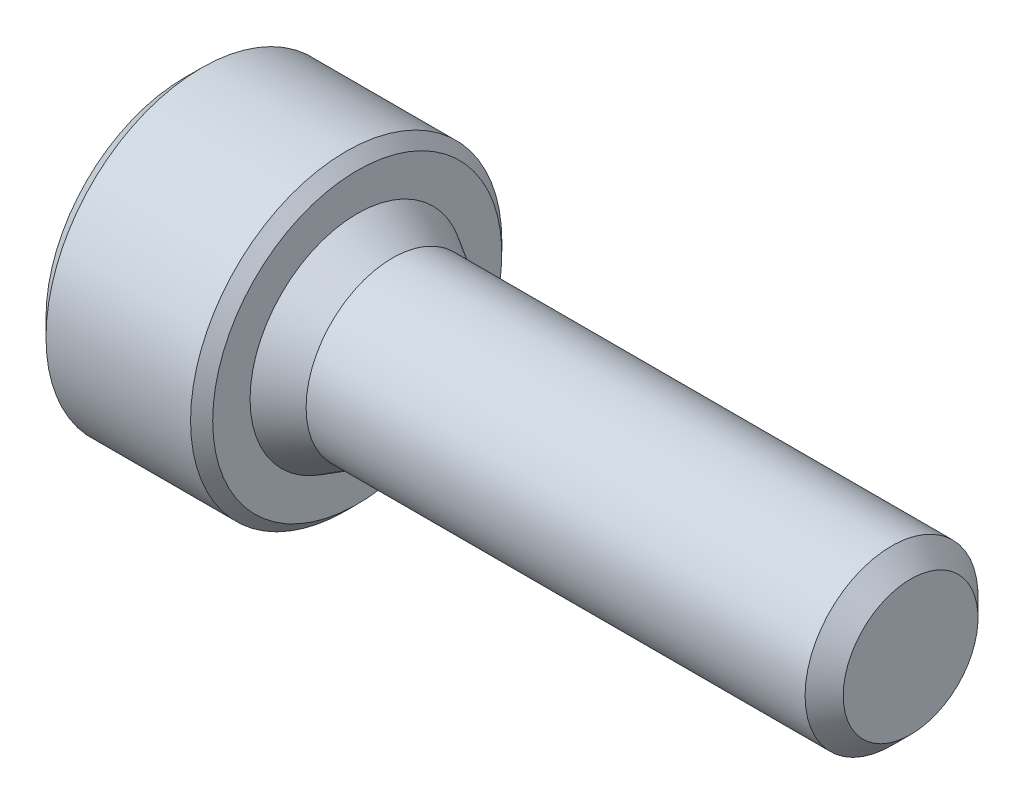
ISO-10303-21;
HEADER;
FILE_DESCRIPTION(('STEP AP214'),'2;1');
FILE_NAME('part.step','',(''),(''),'','','');
FILE_SCHEMA(('AUTOMOTIVE_DESIGN { 1 0 10303 214 1 1 1 1 }'));
ENDSEC;
DATA;
#1=APPLICATION_CONTEXT('core data for automotive mechanical design processes');
#2=APPLICATION_PROTOCOL_DEFINITION('international standard','automotive_design',2000,#1);
#3=PRODUCT_CONTEXT('',#1,'mechanical');
#4=PRODUCT('Part','Part','',(#3));
#5=PRODUCT_RELATED_PRODUCT_CATEGORY('part','',(#4));
#6=PRODUCT_DEFINITION_FORMATION('','',#4);
#7=PRODUCT_DEFINITION_CONTEXT('part definition',#1,'design');
#8=PRODUCT_DEFINITION('design','',#6,#7);
#9=PRODUCT_DEFINITION_SHAPE('','',#8);
#10=(LENGTH_UNIT() NAMED_UNIT(*) SI_UNIT(.MILLI.,.METRE.));
#11=(NAMED_UNIT(*) PLANE_ANGLE_UNIT() SI_UNIT($,.RADIAN.));
#12=(NAMED_UNIT(*) SI_UNIT($,.STERADIAN.) SOLID_ANGLE_UNIT());
#13=UNCERTAINTY_MEASURE_WITH_UNIT(LENGTH_MEASURE(1.E-05),#10,'distance_accuracy_value','');
#14=(GEOMETRIC_REPRESENTATION_CONTEXT(3) GLOBAL_UNCERTAINTY_ASSIGNED_CONTEXT((#13)) GLOBAL_UNIT_ASSIGNED_CONTEXT((#10,
#11,#12)) REPRESENTATION_CONTEXT('',''));
#15=CARTESIAN_POINT('',(0.,0.,0.));
#16=DIRECTION('',(0.,0.,1.));
#17=DIRECTION('',(1.,0.,0.));
#18=AXIS2_PLACEMENT_3D('',#15,#16,#17);
#19=CARTESIAN_POINT('',(-2.36,0.,0.));
#20=DIRECTION('',(-1.,0.,0.));
#21=DIRECTION('',(0.,0.,1.));
#22=AXIS2_PLACEMENT_3D('',#19,#20,#21);
#23=CONICAL_SURFACE('',#22,1.,0.785398163397448);
#24=CARTESIAN_POINT('',(-3.36750105605465,-1.7407068937821,1.));
#25=CARTESIAN_POINT('',(-3.32286035027482,-1.68920392528092,1.));
#26=CARTESIAN_POINT('',(-3.27847887616892,-1.63747156166965,1.));
#27=CARTESIAN_POINT('',(-3.19041923166882,-1.5333701326991,1.));
#28=CARTESIAN_POINT('',(-3.14674140658326,-1.4810007756127,1.));
#29=CARTESIAN_POINT('',(-3.05931926103156,-1.37427842795263,1.));
#30=CARTESIAN_POINT('',(-3.01559668363728,-1.31990755405581,1.));
#31=CARTESIAN_POINT('',(-2.92948251669072,-1.21013905597685,1.));
#32=CARTESIAN_POINT('',(-2.88709059607565,-1.15474169272461,1.));
#33=CARTESIAN_POINT('',(-2.8040857047358,-1.04250399658773,1.));
#34=CARTESIAN_POINT('',(-2.76347521302879,-0.985661816535441,1.));
#35=CARTESIAN_POINT('',(-2.68487260640411,-0.87010806023053,1.));
#36=CARTESIAN_POINT('',(-2.64688264047748,-0.811395006093561,1.));
#37=CARTESIAN_POINT('',(-2.57515477532347,-0.69199827583144,1.));
#38=CARTESIAN_POINT('',(-2.54138616662624,-0.631333428155187,1.));
#39=CARTESIAN_POINT('',(-2.47991094550356,-0.507072634282912,1.));
#40=CARTESIAN_POINT('',(-2.45219316281335,-0.443482356069482,1.));
#41=CARTESIAN_POINT('',(-2.405499272471,-0.311321221991875,1.));
#42=CARTESIAN_POINT('',(-2.38673222526023,-0.24267084963982,1.));
#43=CARTESIAN_POINT('',(-2.36891272303976,-0.138150227370316,1.));
#44=CARTESIAN_POINT('',(-2.36469235030083,-0.103148228277481,1.));
#45=CARTESIAN_POINT('',(-2.35992878436096,-0.0328881435845683,1.));
#46=CARTESIAN_POINT('',(-2.35938521022145,0.0023699151072618,1.));
#47=CARTESIAN_POINT('',(-2.36202627188818,0.0727827684601028,1.));
#48=CARTESIAN_POINT('',(-2.36521522408333,0.107937396341259,1.));
#49=CARTESIAN_POINT('',(-2.3750867935487,0.177755171881169,1.));
#50=CARTESIAN_POINT('',(-2.38177068246881,0.212418135927244,1.));
#51=CARTESIAN_POINT('',(-2.39825291567442,0.281238942104452,1.));
#52=CARTESIAN_POINT('',(-2.40807270953323,0.315391557797059,1.));
#53=CARTESIAN_POINT('',(-2.43030221574655,0.382829270052337,1.));
#54=CARTESIAN_POINT('',(-2.44271195410737,0.416114357900164,1.));
#55=CARTESIAN_POINT('',(-2.48917118352782,0.529593235871621,1.));
#56=CARTESIAN_POINT('',(-2.52845132750847,0.60763092048968,1.));
#57=CARTESIAN_POINT('',(-2.61424227576997,0.75964530278962,1.));
#58=CARTESIAN_POINT('',(-2.6607713632772,0.833611073776003,1.));
#59=CARTESIAN_POINT('',(-2.75840757314621,0.979002191609964,1.));
#60=CARTESIAN_POINT('',(-2.80953783045008,1.05041185113874,1.));
#61=CARTESIAN_POINT('',(-2.91449776435082,1.19106754475187,1.));
#62=CARTESIAN_POINT('',(-2.96832442390138,1.26031586229541,1.));
#63=CARTESIAN_POINT('',(-3.07923007988276,1.39912403822832,1.));
#64=CARTESIAN_POINT('',(-3.13635725354785,1.46864516086898,1.));
#65=CARTESIAN_POINT('',(-3.251364268709,1.60579506034282,1.));
#66=CARTESIAN_POINT('',(-3.30922938917019,1.67343615148247,1.));
#67=CARTESIAN_POINT('',(-3.36750105605455,1.74070689378218,1.));
#68=B_SPLINE_CURVE_WITH_KNOTS('',3,(#24,#25,#26,#27,#28,#29,#30,#31,#32,#33,#34,#35,#36,#37,#38,
#39,#40,#41,#42,#43,#44,#45,#46,#47,#48,#49,#50,#51,#52,#53,#54,#55,#56,#57,#58,#59,#60,#61,#62,
#63,#64,#65,#66,#67),.UNSPECIFIED.,.F.,.F.,(4,2,2,2,2,2,2,2,2,2,2,2,2,2,2,2,2,2,2,2,2,4),(0.,
0.204474811377923,0.409047084486791,0.618342060877502,0.8275845458936,1.03710952772991,
1.24680433886958,1.45487185547542,1.66255195369686,1.87487033826994,1.98046582804522,
2.0860503773216,2.19175714800707,2.29750240741124,2.4039870399009,2.51047274168118,
2.77177332949078,3.03374396802011,3.29711449528732,3.56019664346829,3.8301208425605,
4.09713952953361),.UNSPECIFIED.);
#69=CARTESIAN_POINT('',(-2.5,-0.54735728733616,1.));
#70=VERTEX_POINT('',#69);
#71=CARTESIAN_POINT('',(-2.49999999999974,0.547357287338057,1.));
#72=VERTEX_POINT('',#71);
#73=EDGE_CURVE('E229',#70,#72,#68,.T.);
#74=ORIENTED_EDGE('',*,*,#73,.F.);
#75=CARTESIAN_POINT('',(-2.5,0.,0.));
#76=DIRECTION('',(-1.,0.,0.));
#77=DIRECTION('',(0.,0.,1.));
#78=AXIS2_PLACEMENT_3D('',#75,#76,#77);
#79=CIRCLE('',#78,1.14);
#80=EDGE_CURVE('E246',#70,#72,#79,.T.);
#81=ORIENTED_EDGE('',*,*,#80,.T.);
#82=EDGE_LOOP('',(#74,#81));
#83=FACE_BOUND('',#82,.T.);
#84=ADVANCED_FACE('F43',(#83),#23,.F.);
#85=CARTESIAN_POINT('',(-2.50020000000003,0.592138547582809,0.974385950466541));
#86=CARTESIAN_POINT('',(-2.48196320584127,0.611131278014126,0.94148957638504));
#87=CARTESIAN_POINT('',(-2.46486510812971,0.630432709829491,0.908058515822001));
#88=CARTESIAN_POINT('',(-2.43368233068803,0.669741655848315,0.839973424125417));
#89=CARTESIAN_POINT('',(-2.41961317850148,0.689752223242682,0.805314104710092));
#90=CARTESIAN_POINT('',(-2.39559404018121,0.73009123293689,0.73544489039271));
#91=CARTESIAN_POINT('',(-2.38558877451638,0.750411215758033,0.700249647737563));
#92=CARTESIAN_POINT('',(-2.37025957634421,0.791456431947178,0.629157247890316));
#93=CARTESIAN_POINT('',(-2.36492558212902,0.81218069551893,0.593261770434592));
#94=CARTESIAN_POINT('',(-2.3601188050706,0.848616165357843,0.530153685475951));
#95=CARTESIAN_POINT('',(-2.35951760086495,0.864291206467804,0.503003717862768));
#96=CARTESIAN_POINT('',(-2.36125744550118,0.895601959388011,0.448771902981733));
#97=CARTESIAN_POINT('',(-2.36359925639881,0.911237659960926,0.421690075177512));
#98=CARTESIAN_POINT('',(-2.37487645271091,0.957903588586549,0.340862315815549));
#99=CARTESIAN_POINT('',(-2.3880638020648,0.988690977957282,0.287536993193034));
#100=CARTESIAN_POINT('',(-2.41781345749885,1.0396576005191,0.199260213425773));
#101=CARTESIAN_POINT('',(-2.4321047440116,1.06019762175112,0.16368385306337));
#102=CARTESIAN_POINT('',(-2.46394027183121,1.10056406598303,0.0937671207328113));
#103=CARTESIAN_POINT('',(-2.48147342530142,1.12039265419409,0.0594229985089012));
#104=CARTESIAN_POINT('',(-2.5002,1.13991225998605,0.0256140495335122));
#105=B_SPLINE_CURVE_WITH_KNOTS('',3,(#85,#86,#87,#88,#89,#90,#91,#92,#93,#94,#95,#96,#97,#98,
#99,#100,#101,#102,#103,#104),.UNSPECIFIED.,.F.,.F.,(4,2,2,2,2,2,2,2,2,4),(0.,0.126486904548906,
0.25360755438275,0.378935926747812,0.503993678761193,0.597924039528067,0.691878727360582,
0.879797958474502,1.01015691721643,1.14007800353995),.UNSPECIFIED.);
#106=CARTESIAN_POINT('',(-2.5,0.592346760116365,0.974025315779649));
#107=VERTEX_POINT('',#106);
#108=CARTESIAN_POINT('',(-2.5,1.13970404745252,0.0259746842203549));
#109=VERTEX_POINT('',#108);
#110=EDGE_CURVE('E362',#107,#109,#105,.T.);
#111=ORIENTED_EDGE('',*,*,#110,.F.);
#112=EDGE_CURVE('E251',#107,#109,#79,.T.);
#113=ORIENTED_EDGE('',*,*,#112,.T.);
#114=EDGE_LOOP('',(#111,#113));
#115=FACE_BOUND('',#114,.T.);
#116=ADVANCED_FACE('F297',(#115),#23,.F.);
#117=CARTESIAN_POINT('',(-2.5002,1.13991225998605,-0.0256140495335521));
#118=CARTESIAN_POINT('',(-2.48196320584124,1.12091952955473,-0.0585104236150492));
#119=CARTESIAN_POINT('',(-2.46486510812969,1.10161809773937,-0.0919414841780837));
#120=CARTESIAN_POINT('',(-2.43368233068802,1.06230915172055,-0.160026575874659));
#121=CARTESIAN_POINT('',(-2.41961317850147,1.04229858432618,-0.19468589528998));
#122=CARTESIAN_POINT('',(-2.39559404018121,1.00195957463198,-0.264555109607352));
#123=CARTESIAN_POINT('',(-2.38558877451638,0.981639591810842,-0.299750352262494));
#124=CARTESIAN_POINT('',(-2.37025957634422,0.940594375621704,-0.37084275210973));
#125=CARTESIAN_POINT('',(-2.36492558212903,0.919870112049954,-0.406738229565449));
#126=CARTESIAN_POINT('',(-2.36011880507061,0.883434642211044,-0.469846314524085));
#127=CARTESIAN_POINT('',(-2.35951760086497,0.867759601101083,-0.496996282137268));
#128=CARTESIAN_POINT('',(-2.3612574455012,0.836448848180875,-0.551228097018303));
#129=CARTESIAN_POINT('',(-2.36359925639883,0.820813147607961,-0.578309924822525));
#130=CARTESIAN_POINT('',(-2.37487645271093,0.774147218982337,-0.659137684184488));
#131=CARTESIAN_POINT('',(-2.38806380206482,0.743359829611604,-0.712463006807004));
#132=CARTESIAN_POINT('',(-2.41781345749887,0.692393207049783,-0.800739786574265));
#133=CARTESIAN_POINT('',(-2.43210474401162,0.671853185817763,-0.836316146936667));
#134=CARTESIAN_POINT('',(-2.46394027183124,0.631486741585857,-0.906232879267224));
#135=CARTESIAN_POINT('',(-2.48147342530145,0.611658153374801,-0.940577001491133));
#136=CARTESIAN_POINT('',(-2.50020000000003,0.592138547582843,-0.974385950466521));
#137=B_SPLINE_CURVE_WITH_KNOTS('',3,(#117,#118,#119,#120,#121,#122,#123,#124,#125,#126,#127,
#128,#129,#130,#131,#132,#133,#134,#135,#136),.UNSPECIFIED.,.F.,.F.,(4,2,2,2,2,2,2,2,2,4),(0.,
0.126486904548886,0.25360755438271,0.378935926747753,0.503993678761114,0.59792403952799,
0.691878727360506,0.879797958474429,1.01015691721635,1.14007800353988),.UNSPECIFIED.);
#138=CARTESIAN_POINT('',(-2.5,1.13970404745252,-0.0259746842203947));
#139=VERTEX_POINT('',#138);
#140=CARTESIAN_POINT('',(-2.5,0.5923467601164,-0.974025315779628));
#141=VERTEX_POINT('',#140);
#142=EDGE_CURVE('E355',#139,#141,#137,.T.);
#143=ORIENTED_EDGE('',*,*,#142,.F.);
#144=EDGE_CURVE('E340',#139,#141,#79,.T.);
#145=ORIENTED_EDGE('',*,*,#144,.T.);
#146=EDGE_LOOP('',(#143,#145));
#147=FACE_BOUND('',#146,.T.);
#148=ADVANCED_FACE('F302',(#147),#23,.F.);
#149=CARTESIAN_POINT('',(-3.36750105605467,1.7407068937821,-1.00000000000004));
#150=CARTESIAN_POINT('',(-3.32286035027484,1.68920392528092,-1.00000000000004));
#151=CARTESIAN_POINT('',(-3.27847887616894,1.63747156166965,-1.00000000000004));
#152=CARTESIAN_POINT('',(-3.19041923166884,1.5333701326991,-1.00000000000004));
#153=CARTESIAN_POINT('',(-3.14674140658328,1.48100077561269,-1.00000000000004));
#154=CARTESIAN_POINT('',(-3.05931926103158,1.37427842795263,-1.00000000000004));
#155=CARTESIAN_POINT('',(-3.0155966836373,1.31990755405581,-1.00000000000004));
#156=CARTESIAN_POINT('',(-2.92948251669074,1.21013905597684,-1.00000000000004));
#157=CARTESIAN_POINT('',(-2.88709059607567,1.15474169272461,-1.00000000000004));
#158=CARTESIAN_POINT('',(-2.80408570473582,1.04250399658772,-1.00000000000004));
#159=CARTESIAN_POINT('',(-2.76347521302881,0.985661816535433,-1.00000000000004));
#160=CARTESIAN_POINT('',(-2.68487260640413,0.870108060230519,-1.00000000000004));
#161=CARTESIAN_POINT('',(-2.64688264047751,0.811395006093549,-1.00000000000004));
#162=CARTESIAN_POINT('',(-2.5751547753235,0.691998275831427,-1.00000000000004));
#163=CARTESIAN_POINT('',(-2.54138616662627,0.631333428155172,-1.00000000000004));
#164=CARTESIAN_POINT('',(-2.47991094550358,0.507072634282896,-1.00000000000004));
#165=CARTESIAN_POINT('',(-2.45219316281338,0.443482356069465,-1.00000000000004));
#166=CARTESIAN_POINT('',(-2.40549927247103,0.311321221991855,-1.00000000000004));
#167=CARTESIAN_POINT('',(-2.38673222526026,0.2426708496398,-1.00000000000004));
#168=CARTESIAN_POINT('',(-2.36891272303979,0.138150227370294,-1.00000000000004));
#169=CARTESIAN_POINT('',(-2.36469235030087,0.103148228277459,-1.00000000000004));
#170=CARTESIAN_POINT('',(-2.359928784361,0.0328881435845455,-1.00000000000004));
#171=CARTESIAN_POINT('',(-2.35938521022149,-0.00236991510728479,-1.00000000000004));
#172=CARTESIAN_POINT('',(-2.36202627188822,-0.072782768460126,-1.00000000000004));
#173=CARTESIAN_POINT('',(-2.36521522408337,-0.107937396341282,-1.00000000000004));
#174=CARTESIAN_POINT('',(-2.37508679354875,-0.177755171881192,-1.00000000000004));
#175=CARTESIAN_POINT('',(-2.38177068246885,-0.212418135927268,-1.00000000000004));
#176=CARTESIAN_POINT('',(-2.39825291567447,-0.281238942104476,-1.00000000000004));
#177=CARTESIAN_POINT('',(-2.40807270953327,-0.315391557797083,-1.00000000000004));
#178=CARTESIAN_POINT('',(-2.4303022157466,-0.38282927005236,-1.00000000000004));
#179=CARTESIAN_POINT('',(-2.44271195410741,-0.416114357900188,-1.00000000000004));
#180=CARTESIAN_POINT('',(-2.48917118352787,-0.52959323587165,-1.00000000000004));
#181=CARTESIAN_POINT('',(-2.52845132750852,-0.607630920489714,-1.00000000000004));
#182=CARTESIAN_POINT('',(-2.61424227577002,-0.759645302789663,-1.00000000000004));
#183=CARTESIAN_POINT('',(-2.66077136327726,-0.83361107377605,-1.00000000000004));
#184=CARTESIAN_POINT('',(-2.75840757314627,-0.97900219161002,-1.00000000000004));
#185=CARTESIAN_POINT('',(-2.80953783045015,-1.0504118511388,-1.00000000000004));
#186=CARTESIAN_POINT('',(-2.9144977643509,-1.19106754475194,-1.00000000000004));
#187=CARTESIAN_POINT('',(-2.96832442390146,-1.26031586229548,-1.00000000000004));
#188=CARTESIAN_POINT('',(-3.07923007988284,-1.39912403822839,-1.00000000000004));
#189=CARTESIAN_POINT('',(-3.13635725354792,-1.46864516086903,-1.00000000000004));
#190=CARTESIAN_POINT('',(-3.25136426870904,-1.60579506034284,-1.00000000000004));
#191=CARTESIAN_POINT('',(-3.30922938917022,-1.67343615148248,-1.00000000000004));
#192=CARTESIAN_POINT('',(-3.36750105605457,-1.74070689378218,-1.00000000000004));
#193=B_SPLINE_CURVE_WITH_KNOTS('',3,(#149,#150,#151,#152,#153,#154,#155,#156,#157,#158,#159,
#160,#161,#162,#163,#164,#165,#166,#167,#168,#169,#170,#171,#172,#173,#174,#175,#176,#177,#178,
#179,#180,#181,#182,#183,#184,#185,#186,#187,#188,#189,#190,#191,#192),.UNSPECIFIED.,.F.,.F.,(4,
2,2,2,2,2,2,2,2,2,2,2,2,2,2,2,2,2,2,2,2,4),(0.,0.204474811377925,0.409047084486793,
0.618342060877506,0.827584545893605,1.03710952772991,1.24680433886959,1.45487185547543,
1.66255195369687,1.87487033826995,1.98046582804523,2.08605037732162,2.19175714800708,
2.29750240741125,2.40398703990092,2.51047274168119,2.77177332949081,3.03374396802016,
3.29711449528739,3.56019664346837,3.83012084256053,4.09713952953359),.UNSPECIFIED.);
#194=CARTESIAN_POINT('',(-2.5,0.54735728733609,-1.00000000000004));
#195=VERTEX_POINT('',#194);
#196=CARTESIAN_POINT('',(-2.49999999999974,-0.547357287337986,-1.00000000000004));
#197=VERTEX_POINT('',#196);
#198=EDGE_CURVE('E347',#195,#197,#193,.T.);
#199=ORIENTED_EDGE('',*,*,#198,.F.);
#200=EDGE_CURVE('E338',#195,#197,#79,.T.);
#201=ORIENTED_EDGE('',*,*,#200,.T.);
#202=EDGE_LOOP('',(#199,#201));
#203=FACE_BOUND('',#202,.T.);
#204=ADVANCED_FACE('F316',(#203),#23,.F.);
#205=CARTESIAN_POINT('',(-2.50020000000003,-0.592138547582843,-0.974385950466521));
#206=CARTESIAN_POINT('',(-2.48196320584127,-0.611131278014159,-0.941489576385021));
#207=CARTESIAN_POINT('',(-2.46486510812971,-0.630432709829523,-0.908058515821984));
#208=CARTESIAN_POINT('',(-2.43368233068804,-0.669741655848345,-0.839973424125403));
#209=CARTESIAN_POINT('',(-2.41961317850149,-0.689752223242711,-0.805314104710079));
#210=CARTESIAN_POINT('',(-2.39559404018122,-0.730091232936917,-0.735444890392701));
#211=CARTESIAN_POINT('',(-2.38558877451639,-0.750411215758059,-0.700249647737556));
#212=CARTESIAN_POINT('',(-2.37025957634423,-0.791456431947202,-0.629157247890313));
#213=CARTESIAN_POINT('',(-2.36492558212903,-0.812180695518953,-0.593261770434591));
#214=CARTESIAN_POINT('',(-2.36011880507062,-0.848616165357865,-0.530153685475951));
#215=CARTESIAN_POINT('',(-2.35951760086497,-0.864291206467826,-0.503003717862768));
#216=CARTESIAN_POINT('',(-2.3612574455012,-0.895601959388034,-0.448771902981733));
#217=CARTESIAN_POINT('',(-2.36359925639883,-0.911237659960949,-0.421690075177511));
#218=CARTESIAN_POINT('',(-2.37487645271093,-0.957903588586573,-0.340862315815547));
#219=CARTESIAN_POINT('',(-2.38806380206482,-0.988690977957306,-0.287536993193031));
#220=CARTESIAN_POINT('',(-2.41781345749887,-1.03965760051912,-0.199260213425777));
#221=CARTESIAN_POINT('',(-2.43210474401161,-1.06019762175114,-0.163683853063382));
#222=CARTESIAN_POINT('',(-2.46394027183122,-1.10056406598304,-0.0937671207328372));
#223=CARTESIAN_POINT('',(-2.48147342530143,-1.12039265419409,-0.0594229985089343));
#224=CARTESIAN_POINT('',(-2.5002,-1.13991225998605,-0.0256140495335522));
#225=B_SPLINE_CURVE_WITH_KNOTS('',3,(#205,#206,#207,#208,#209,#210,#211,#212,#213,#214,#215,
#216,#217,#218,#219,#220,#221,#222,#223,#224),.UNSPECIFIED.,.F.,.F.,(4,2,2,2,2,2,2,2,2,4),(0.,
0.126486904548899,0.253607554382735,0.37893592674779,0.503993678761164,0.597924039528039,
0.691878727360556,0.879797958474479,1.01015691721638,1.14007800353988),.UNSPECIFIED.);
#226=CARTESIAN_POINT('',(-2.5,-0.592346760116399,-0.974025315779628));
#227=VERTEX_POINT('',#226);
#228=CARTESIAN_POINT('',(-2.5,-1.13970404745252,-0.0259746842203946));
#229=VERTEX_POINT('',#228);
#230=EDGE_CURVE('E327',#227,#229,#225,.T.);
#231=ORIENTED_EDGE('',*,*,#230,.F.);
#232=EDGE_CURVE('E329',#227,#229,#79,.T.);
#233=ORIENTED_EDGE('',*,*,#232,.T.);
#234=EDGE_LOOP('',(#231,#233));
#235=FACE_BOUND('',#234,.T.);
#236=ADVANCED_FACE('F307',(#235),#23,.F.);
#237=CARTESIAN_POINT('',(0.,2.25,0.));
#238=DIRECTION('',(-1.,0.,0.));
#239=DIRECTION('',(0.,0.,1.));
#240=AXIS2_PLACEMENT_3D('',#237,#238,#239);
#241=PLANE('',#240);
#242=CARTESIAN_POINT('',(0.,0.,0.));
#243=DIRECTION('',(-1.,0.,0.));
#244=DIRECTION('',(0.,0.,1.));
#245=AXIS2_PLACEMENT_3D('',#242,#243,#244);
#246=CIRCLE('',#245,1.55);
#247=CARTESIAN_POINT('',(0.,0.,1.55));
#248=VERTEX_POINT('',#247);
#249=EDGE_CURVE('E11',#248,#248,#246,.T.);
#250=ORIENTED_EDGE('',*,*,#249,.T.);
#251=EDGE_LOOP('',(#250));
#252=FACE_BOUND('',#251,.T.);
#253=CARTESIAN_POINT('',(0.,0.,0.));
#254=DIRECTION('',(-1.,0.,0.));
#255=DIRECTION('',(0.,0.,1.));
#256=AXIS2_PLACEMENT_3D('',#253,#254,#255);
#257=CIRCLE('',#256,2.09);
#258=CARTESIAN_POINT('',(0.,0.,2.09));
#259=VERTEX_POINT('',#258);
#260=EDGE_CURVE('E252',#259,#259,#257,.T.);
#261=ORIENTED_EDGE('',*,*,#260,.F.);
#262=EDGE_LOOP('',(#261));
#263=FACE_BOUND('',#262,.T.);
#264=ADVANCED_FACE('F315',(#252,#263),#241,.F.);
#265=CARTESIAN_POINT('',(0.51,0.,0.));
#266=DIRECTION('',(-1.,0.,0.));
#267=DIRECTION('',(0.,0.,1.));
#268=AXIS2_PLACEMENT_3D('',#265,#266,#267);
#269=CONICAL_SURFACE('',#268,1.25,0.531724067258806);
#270=ORIENTED_EDGE('',*,*,#249,.F.);
#271=EDGE_LOOP('',(#270));
#272=FACE_BOUND('',#271,.T.);
#273=CARTESIAN_POINT('',(0.51,0.,0.));
#274=DIRECTION('',(-1.,0.,0.));
#275=DIRECTION('',(0.,0.,1.));
#276=AXIS2_PLACEMENT_3D('',#273,#274,#275);
#277=CIRCLE('',#276,1.25);
#278=CARTESIAN_POINT('',(0.51,0.,1.25));
#279=VERTEX_POINT('',#278);
#280=EDGE_CURVE('E51',#279,#279,#277,.T.);
#281=ORIENTED_EDGE('',*,*,#280,.T.);
#282=EDGE_LOOP('',(#281));
#283=FACE_BOUND('',#282,.T.);
#284=ADVANCED_FACE('F272',(#272,#283),#269,.T.);
#285=CARTESIAN_POINT('',(8.,0.,0.));
#286=DIRECTION('',(-1.,0.,0.));
#287=DIRECTION('',(0.,0.,1.));
#288=AXIS2_PLACEMENT_3D('',#285,#286,#287);
#289=CYLINDRICAL_SURFACE('',#288,1.25);
#290=ORIENTED_EDGE('',*,*,#280,.F.);
#291=EDGE_LOOP('',(#290));
#292=FACE_BOUND('',#291,.T.);
#293=CARTESIAN_POINT('',(7.724,0.,0.));
#294=DIRECTION('',(-1.,0.,0.));
#295=DIRECTION('',(0.,0.,1.));
#296=AXIS2_PLACEMENT_3D('',#293,#294,#295);
#297=CIRCLE('',#296,1.25);
#298=CARTESIAN_POINT('',(7.724,0.,1.25));
#299=VERTEX_POINT('',#298);
#300=EDGE_CURVE('E267',#299,#299,#297,.T.);
#301=ORIENTED_EDGE('',*,*,#300,.T.);
#302=EDGE_LOOP('',(#301));
#303=FACE_BOUND('',#302,.T.);
#304=ADVANCED_FACE('F274',(#292,#303),#289,.T.);
#305=CARTESIAN_POINT('',(8.,0.,0.));
#306=DIRECTION('',(-1.,0.,0.));
#307=DIRECTION('',(0.,0.,1.));
#308=AXIS2_PLACEMENT_3D('',#305,#306,#307);
#309=CONICAL_SURFACE('',#308,0.974,0.785398163397448);
#310=ORIENTED_EDGE('',*,*,#300,.F.);
#311=EDGE_LOOP('',(#310));
#312=FACE_BOUND('',#311,.T.);
#313=CARTESIAN_POINT('',(8.,0.,0.));
#314=DIRECTION('',(-1.,0.,0.));
#315=DIRECTION('',(0.,0.,1.));
#316=AXIS2_PLACEMENT_3D('',#313,#314,#315);
#317=CIRCLE('',#316,0.974);
#318=CARTESIAN_POINT('',(8.,0.,0.974));
#319=VERTEX_POINT('',#318);
#320=EDGE_CURVE('E264',#319,#319,#317,.T.);
#321=ORIENTED_EDGE('',*,*,#320,.T.);
#322=EDGE_LOOP('',(#321));
#323=FACE_BOUND('',#322,.T.);
#324=ADVANCED_FACE('F277',(#312,#323),#309,.T.);
#325=CARTESIAN_POINT('',(8.,0.974,0.));
#326=DIRECTION('',(-1.,0.,0.));
#327=DIRECTION('',(0.,0.,1.));
#328=AXIS2_PLACEMENT_3D('',#325,#326,#327);
#329=PLANE('',#328);
#330=ORIENTED_EDGE('',*,*,#320,.F.);
#331=EDGE_LOOP('',(#330));
#332=FACE_BOUND('',#331,.T.);
#333=ADVANCED_FACE('F283',(#332),#329,.F.);
#334=CARTESIAN_POINT('',(-0.16,0.,0.));
#335=DIRECTION('',(-1.,0.,0.));
#336=DIRECTION('',(0.,0.,1.));
#337=AXIS2_PLACEMENT_3D('',#334,#335,#336);
#338=CONICAL_SURFACE('',#337,2.25,0.78539816339745);
#339=ORIENTED_EDGE('',*,*,#260,.T.);
#340=EDGE_LOOP('',(#339));
#341=FACE_BOUND('',#340,.T.);
#342=CARTESIAN_POINT('',(-0.16,0.,0.));
#343=DIRECTION('',(-1.,0.,0.));
#344=DIRECTION('',(0.,0.,1.));
#345=AXIS2_PLACEMENT_3D('',#342,#343,#344);
#346=CIRCLE('',#345,2.25);
#347=CARTESIAN_POINT('',(-0.16,0.,2.25));
#348=VERTEX_POINT('',#347);
#349=EDGE_CURVE('E255',#348,#348,#346,.T.);
#350=ORIENTED_EDGE('',*,*,#349,.F.);
#351=EDGE_LOOP('',(#350));
#352=FACE_BOUND('',#351,.T.);
#353=ADVANCED_FACE('F288',(#341,#352),#338,.T.);
#354=CARTESIAN_POINT('',(8.,0.,0.));
#355=DIRECTION('',(-1.,0.,0.));
#356=DIRECTION('',(0.,0.,1.));
#357=AXIS2_PLACEMENT_3D('',#354,#355,#356);
#358=CYLINDRICAL_SURFACE('',#357,2.25);
#359=ORIENTED_EDGE('',*,*,#349,.T.);
#360=EDGE_LOOP('',(#359));
#361=FACE_BOUND('',#360,.T.);
#362=CARTESIAN_POINT('',(-2.25,0.,0.));
#363=DIRECTION('',(-1.,0.,0.));
#364=DIRECTION('',(0.,0.,1.));
#365=AXIS2_PLACEMENT_3D('',#362,#363,#364);
#366=CIRCLE('',#365,2.25);
#367=CARTESIAN_POINT('',(-2.25,0.,2.25));
#368=VERTEX_POINT('',#367);
#369=EDGE_CURVE('E258',#368,#368,#366,.T.);
#370=ORIENTED_EDGE('',*,*,#369,.F.);
#371=EDGE_LOOP('',(#370));
#372=FACE_BOUND('',#371,.T.);
#373=ADVANCED_FACE('F293',(#361,#372),#358,.T.);
#374=CARTESIAN_POINT('',(-2.5,0.,0.));
#375=DIRECTION('',(1.,0.,0.));
#376=DIRECTION('',(0.,0.,-1.));
#377=AXIS2_PLACEMENT_3D('',#374,#375,#376);
#378=CONICAL_SURFACE('',#377,2.,0.785398163397449);
#379=ORIENTED_EDGE('',*,*,#369,.T.);
#380=EDGE_LOOP('',(#379));
#381=FACE_BOUND('',#380,.T.);
#382=CARTESIAN_POINT('',(-2.5,0.,0.));
#383=DIRECTION('',(-1.,0.,0.));
#384=DIRECTION('',(0.,0.,1.));
#385=AXIS2_PLACEMENT_3D('',#382,#383,#384);
#386=CIRCLE('',#385,2.);
#387=CARTESIAN_POINT('',(-2.5,0.,2.));
#388=VERTEX_POINT('',#387);
#389=EDGE_CURVE('E261',#388,#388,#386,.T.);
#390=ORIENTED_EDGE('',*,*,#389,.F.);
#391=EDGE_LOOP('',(#390));
#392=FACE_BOUND('',#391,.T.);
#393=ADVANCED_FACE('F311',(#381,#392),#378,.T.);
#394=CARTESIAN_POINT('',(-2.5,0.,0.));
#395=DIRECTION('',(1.,0.,0.));
#396=DIRECTION('',(0.,0.,-1.));
#397=AXIS2_PLACEMENT_3D('',#394,#395,#396);
#398=PLANE('',#397);
#399=DIRECTION('',(0.,-0.5,0.866025403784439));
#400=VECTOR('',#399,1.);
#401=CARTESIAN_POINT('',(-2.5,0.866025403784442,0.500000000000002));
#402=LINE('',#401,#400);
#403=CARTESIAN_POINT('',(-2.5,0.57735026918963,1.));
#404=VERTEX_POINT('',#403);
#405=EDGE_CURVE('E242',#107,#404,#402,.T.);
#406=ORIENTED_EDGE('',*,*,#405,.T.);
#407=DIRECTION('',(0.,-1.,0.));
#408=VECTOR('',#407,1.);
#409=CARTESIAN_POINT('',(-2.5,0.,1.));
#410=LINE('',#409,#408);
#411=EDGE_CURVE('E237',#404,#72,#410,.T.);
#412=ORIENTED_EDGE('',*,*,#411,.T.);
#413=ORIENTED_EDGE('',*,*,#80,.F.);
#414=CARTESIAN_POINT('',(-2.5,-0.57735026918963,1.));
#415=VERTEX_POINT('',#414);
#416=EDGE_CURVE('E236',#70,#415,#410,.T.);
#417=ORIENTED_EDGE('',*,*,#416,.T.);
#418=DIRECTION('',(0.,-0.5,-0.866025403784439));
#419=VECTOR('',#418,1.);
#420=CARTESIAN_POINT('',(-2.5,-0.866025403784442,0.500000000000002));
#421=LINE('',#420,#419);
#422=CARTESIAN_POINT('',(-2.5,-0.592346760116365,0.974025315779649));
#423=VERTEX_POINT('',#422);
#424=EDGE_CURVE('E159',#415,#423,#421,.T.);
#425=ORIENTED_EDGE('',*,*,#424,.T.);
#426=CARTESIAN_POINT('',(-2.5,-1.13970404745252,0.0259746842203546));
#427=VERTEX_POINT('',#426);
#428=EDGE_CURVE('E250',#427,#423,#79,.T.);
#429=ORIENTED_EDGE('',*,*,#428,.F.);
#430=CARTESIAN_POINT('',(-2.5,-1.15470053837927,0.));
#431=VERTEX_POINT('',#430);
#432=EDGE_CURVE('E210',#427,#431,#421,.T.);
#433=ORIENTED_EDGE('',*,*,#432,.T.);
#434=DIRECTION('',(0.,0.5,-0.866025403784438));
#435=VECTOR('',#434,1.);
#436=CARTESIAN_POINT('',(-2.5,-0.866025403784458,-0.500000000000012));
#437=LINE('',#436,#435);
#438=EDGE_CURVE('E332',#431,#229,#437,.T.);
#439=ORIENTED_EDGE('',*,*,#438,.T.);
#440=ORIENTED_EDGE('',*,*,#232,.F.);
#441=CARTESIAN_POINT('',(-2.5,-0.57735026918963,-1.00000000000004));
#442=VERTEX_POINT('',#441);
#443=EDGE_CURVE('E331',#227,#442,#437,.T.);
#444=ORIENTED_EDGE('',*,*,#443,.T.);
#445=DIRECTION('',(0.,1.,0.));
#446=VECTOR('',#445,1.);
#447=CARTESIAN_POINT('',(-2.5,0.,-1.00000000000004));
#448=LINE('',#447,#446);
#449=EDGE_CURVE('E346',#442,#197,#448,.T.);
#450=ORIENTED_EDGE('',*,*,#449,.T.);
#451=ORIENTED_EDGE('',*,*,#200,.F.);
#452=CARTESIAN_POINT('',(-2.5,0.57735026918963,-1.00000000000004));
#453=VERTEX_POINT('',#452);
#454=EDGE_CURVE('E349',#195,#453,#448,.T.);
#455=ORIENTED_EDGE('',*,*,#454,.T.);
#456=DIRECTION('',(0.,0.5,0.866025403784439));
#457=VECTOR('',#456,1.);
#458=CARTESIAN_POINT('',(-2.5,0.866025403784458,-0.500000000000011));
#459=LINE('',#458,#457);
#460=EDGE_CURVE('E353',#453,#141,#459,.T.);
#461=ORIENTED_EDGE('',*,*,#460,.T.);
#462=ORIENTED_EDGE('',*,*,#144,.F.);
#463=CARTESIAN_POINT('',(-2.5,1.15470053837927,0.));
#464=VERTEX_POINT('',#463);
#465=EDGE_CURVE('E357',#139,#464,#459,.T.);
#466=ORIENTED_EDGE('',*,*,#465,.T.);
#467=EDGE_CURVE('E238',#464,#109,#402,.T.);
#468=ORIENTED_EDGE('',*,*,#467,.T.);
#469=ORIENTED_EDGE('',*,*,#112,.F.);
#470=EDGE_LOOP('',(#406,#412,#413,#417,#425,#429,#433,#439,#440,#444,#450,#451,#455,#461,#462,
#466,#468,#469));
#471=FACE_BOUND('',#470,.T.);
#472=ORIENTED_EDGE('',*,*,#389,.T.);
#473=EDGE_LOOP('',(#472));
#474=FACE_BOUND('',#473,.T.);
#475=ADVANCED_FACE('F45',(#471,#474),#398,.F.);
#476=CARTESIAN_POINT('',(-2.5002,-1.13991225998605,0.0256140495335122));
#477=CARTESIAN_POINT('',(-2.48196320584124,-1.12091952955473,0.0585104236150107));
#478=CARTESIAN_POINT('',(-2.46486510812968,-1.10161809773937,0.0919414841780468));
#479=CARTESIAN_POINT('',(-2.43368233068801,-1.06230915172055,0.160026575874626));
#480=CARTESIAN_POINT('',(-2.41961317850147,-1.04229858432618,0.194685895289948));
#481=CARTESIAN_POINT('',(-2.3955940401812,-1.00195957463198,0.264555109607324));
#482=CARTESIAN_POINT('',(-2.38558877451637,-0.981639591810835,0.299750352262467));
#483=CARTESIAN_POINT('',(-2.3702595763442,-0.940594375621695,0.370842752109707));
#484=CARTESIAN_POINT('',(-2.36492558212901,-0.919870112049944,0.406738229565428));
#485=CARTESIAN_POINT('',(-2.3601188050706,-0.883434642211033,0.469846314524065));
#486=CARTESIAN_POINT('',(-2.35951760086495,-0.867759601101073,0.496996282137248));
#487=CARTESIAN_POINT('',(-2.36125744550118,-0.836448848180865,0.551228097018282));
#488=CARTESIAN_POINT('',(-2.36359925639881,-0.820813147607951,0.578309924822504));
#489=CARTESIAN_POINT('',(-2.37487645271091,-0.774147218982328,0.659137684184465));
#490=CARTESIAN_POINT('',(-2.3880638020648,-0.743359829611596,0.71246300680698));
#491=CARTESIAN_POINT('',(-2.41781345749885,-0.69239320704977,0.800739786574248));
#492=CARTESIAN_POINT('',(-2.43210474401161,-0.671853185817746,0.836316146936658));
#493=CARTESIAN_POINT('',(-2.46394027183123,-0.631486741585831,0.90623287926723));
#494=CARTESIAN_POINT('',(-2.48147342530145,-0.611658153374771,0.940577001491147));
#495=CARTESIAN_POINT('',(-2.50020000000003,-0.592138547582809,0.974385950466542));
#496=B_SPLINE_CURVE_WITH_KNOTS('',3,(#476,#477,#478,#479,#480,#481,#482,#483,#484,#485,#486,
#487,#488,#489,#490,#491,#492,#493,#494,#495),.UNSPECIFIED.,.F.,.F.,(4,2,2,2,2,2,2,2,2,4),(0.,
0.126486904548894,0.253607554382725,0.378935926747775,0.503993678761143,0.597924039528017,
0.691878727360531,0.879797958474451,1.0101569172164,1.14007800353996),.UNSPECIFIED.);
#497=EDGE_CURVE('E202',#427,#423,#496,.T.);
#498=ORIENTED_EDGE('',*,*,#497,.F.);
#499=ORIENTED_EDGE('',*,*,#428,.T.);
#500=EDGE_LOOP('',(#498,#499));
#501=FACE_BOUND('',#500,.T.);
#502=ADVANCED_FACE('F212',(#501),#23,.F.);
#503=CARTESIAN_POINT('',(-3.6,0.57735026918963,1.));
#504=DIRECTION('',(0.,0.,1.));
#505=DIRECTION('',(1.,0.,0.));
#506=AXIS2_PLACEMENT_3D('',#503,#504,#505);
#507=PLANE('',#506);
#508=ORIENTED_EDGE('',*,*,#73,.T.);
#509=ORIENTED_EDGE('',*,*,#411,.F.);
#510=DIRECTION('',(1.,0.,0.));
#511=VECTOR('',#510,1.);
#512=CARTESIAN_POINT('',(-3.6,0.57735026918963,1.));
#513=LINE('',#512,#511);
#514=CARTESIAN_POINT('',(-1.4,0.57735026918963,1.));
#515=VERTEX_POINT('',#514);
#516=EDGE_CURVE('E193',#404,#515,#513,.T.);
#517=ORIENTED_EDGE('',*,*,#516,.T.);
#518=DIRECTION('',(0.,-1.,0.));
#519=VECTOR('',#518,1.);
#520=CARTESIAN_POINT('',(-1.4,0.57735026918963,1.));
#521=LINE('',#520,#519);
#522=CARTESIAN_POINT('',(-1.4,0.,1.));
#523=VERTEX_POINT('',#522);
#524=EDGE_CURVE('E170',#515,#523,#521,.T.);
#525=ORIENTED_EDGE('',*,*,#524,.T.);
#526=CARTESIAN_POINT('',(-1.4,-0.57735026918963,1.));
#527=VERTEX_POINT('',#526);
#528=EDGE_CURVE('E167',#523,#527,#521,.T.);
#529=ORIENTED_EDGE('',*,*,#528,.T.);
#530=DIRECTION('',(1.,0.,0.));
#531=VECTOR('',#530,1.);
#532=CARTESIAN_POINT('',(-3.6,-0.57735026918963,1.));
#533=LINE('',#532,#531);
#534=EDGE_CURVE('E151',#415,#527,#533,.T.);
#535=ORIENTED_EDGE('',*,*,#534,.F.);
#536=ORIENTED_EDGE('',*,*,#416,.F.);
#537=EDGE_LOOP('',(#508,#509,#517,#525,#529,#535,#536));
#538=FACE_BOUND('',#537,.T.);
#539=ADVANCED_FACE('F168',(#538),#507,.F.);
#540=CARTESIAN_POINT('',(-3.6,1.15470053837927,0.));
#541=DIRECTION('',(0.,0.866025403784439,0.5));
#542=DIRECTION('',(0.,-0.5,0.866025403784439));
#543=AXIS2_PLACEMENT_3D('',#540,#541,#542);
#544=PLANE('',#543);
#545=ORIENTED_EDGE('',*,*,#110,.T.);
#546=ORIENTED_EDGE('',*,*,#467,.F.);
#547=DIRECTION('',(1.,0.,0.));
#548=VECTOR('',#547,1.);
#549=CARTESIAN_POINT('',(-3.6,1.15470053837927,0.));
#550=LINE('',#549,#548);
#551=CARTESIAN_POINT('',(-1.4,1.15470053837927,0.));
#552=VERTEX_POINT('',#551);
#553=EDGE_CURVE('E195',#464,#552,#550,.T.);
#554=ORIENTED_EDGE('',*,*,#553,.T.);
#555=DIRECTION('',(0.,-0.5,0.866025403784439));
#556=VECTOR('',#555,1.);
#557=CARTESIAN_POINT('',(-1.4,1.15470053837927,0.));
#558=LINE('',#557,#556);
#559=CARTESIAN_POINT('',(-1.4,0.866025403784442,0.500000000000002));
#560=VERTEX_POINT('',#559);
#561=EDGE_CURVE('E163',#552,#560,#558,.T.);
#562=ORIENTED_EDGE('',*,*,#561,.T.);
#563=EDGE_CURVE('E190',#560,#515,#558,.T.);
#564=ORIENTED_EDGE('',*,*,#563,.T.);
#565=ORIENTED_EDGE('',*,*,#516,.F.);
#566=ORIENTED_EDGE('',*,*,#405,.F.);
#567=EDGE_LOOP('',(#545,#546,#554,#562,#564,#565,#566));
#568=FACE_BOUND('',#567,.T.);
#569=ADVANCED_FACE('F226',(#568),#544,.F.);
#570=CARTESIAN_POINT('',(-3.6,0.57735026918963,-1.00000000000004));
#571=DIRECTION('',(0.,0.866025403784439,-0.5));
#572=DIRECTION('',(0.,0.5,0.866025403784439));
#573=AXIS2_PLACEMENT_3D('',#570,#571,#572);
#574=PLANE('',#573);
#575=ORIENTED_EDGE('',*,*,#142,.T.);
#576=ORIENTED_EDGE('',*,*,#460,.F.);
#577=DIRECTION('',(1.,0.,0.));
#578=VECTOR('',#577,1.);
#579=CARTESIAN_POINT('',(-3.6,0.57735026918963,-1.00000000000004));
#580=LINE('',#579,#578);
#581=CARTESIAN_POINT('',(-1.4,0.57735026918963,-1.00000000000004));
#582=VERTEX_POINT('',#581);
#583=EDGE_CURVE('E197',#453,#582,#580,.T.);
#584=ORIENTED_EDGE('',*,*,#583,.T.);
#585=DIRECTION('',(0.,0.5,0.866025403784439));
#586=VECTOR('',#585,1.);
#587=CARTESIAN_POINT('',(-1.4,0.57735026918963,-1.00000000000004));
#588=LINE('',#587,#586);
#589=CARTESIAN_POINT('',(-1.4,0.866025403784459,-0.500000000000012));
#590=VERTEX_POINT('',#589);
#591=EDGE_CURVE('E187',#582,#590,#588,.T.);
#592=ORIENTED_EDGE('',*,*,#591,.T.);
#593=EDGE_CURVE('E186',#590,#552,#588,.T.);
#594=ORIENTED_EDGE('',*,*,#593,.T.);
#595=ORIENTED_EDGE('',*,*,#553,.F.);
#596=ORIENTED_EDGE('',*,*,#465,.F.);
#597=EDGE_LOOP('',(#575,#576,#584,#592,#594,#595,#596));
#598=FACE_BOUND('',#597,.T.);
#599=ADVANCED_FACE('F372',(#598),#574,.F.);
#600=CARTESIAN_POINT('',(-3.6,-0.57735026918963,-1.00000000000004));
#601=DIRECTION('',(0.,0.,-1.));
#602=DIRECTION('',(-1.,0.,0.));
#603=AXIS2_PLACEMENT_3D('',#600,#601,#602);
#604=PLANE('',#603);
#605=ORIENTED_EDGE('',*,*,#198,.T.);
#606=ORIENTED_EDGE('',*,*,#449,.F.);
#607=DIRECTION('',(1.,0.,0.));
#608=VECTOR('',#607,1.);
#609=CARTESIAN_POINT('',(-3.6,-0.57735026918963,-1.00000000000004));
#610=LINE('',#609,#608);
#611=CARTESIAN_POINT('',(-1.4,-0.57735026918963,-1.00000000000004));
#612=VERTEX_POINT('',#611);
#613=EDGE_CURVE('E199',#442,#612,#610,.T.);
#614=ORIENTED_EDGE('',*,*,#613,.T.);
#615=DIRECTION('',(0.,1.,0.));
#616=VECTOR('',#615,1.);
#617=CARTESIAN_POINT('',(-1.4,-0.57735026918963,-1.00000000000004));
#618=LINE('',#617,#616);
#619=CARTESIAN_POINT('',(-1.4,0.,-1.00000000000004));
#620=VERTEX_POINT('',#619);
#621=EDGE_CURVE('E183',#612,#620,#618,.T.);
#622=ORIENTED_EDGE('',*,*,#621,.T.);
#623=EDGE_CURVE('E182',#620,#582,#618,.T.);
#624=ORIENTED_EDGE('',*,*,#623,.T.);
#625=ORIENTED_EDGE('',*,*,#583,.F.);
#626=ORIENTED_EDGE('',*,*,#454,.F.);
#627=EDGE_LOOP('',(#605,#606,#614,#622,#624,#625,#626));
#628=FACE_BOUND('',#627,.T.);
#629=ADVANCED_FACE('F406',(#628),#604,.F.);
#630=CARTESIAN_POINT('',(-3.6,-1.15470053837927,0.));
#631=DIRECTION('',(0.,-0.866025403784439,-0.5));
#632=DIRECTION('',(0.,0.5,-0.866025403784438));
#633=AXIS2_PLACEMENT_3D('',#630,#631,#632);
#634=PLANE('',#633);
#635=ORIENTED_EDGE('',*,*,#230,.T.);
#636=ORIENTED_EDGE('',*,*,#438,.F.);
#637=DIRECTION('',(1.,0.,0.));
#638=VECTOR('',#637,1.);
#639=CARTESIAN_POINT('',(-3.6,-1.15470053837927,0.));
#640=LINE('',#639,#638);
#641=CARTESIAN_POINT('',(-1.4,-1.15470053837927,0.));
#642=VERTEX_POINT('',#641);
#643=EDGE_CURVE('E162',#431,#642,#640,.T.);
#644=ORIENTED_EDGE('',*,*,#643,.T.);
#645=DIRECTION('',(0.,0.5,-0.866025403784438));
#646=VECTOR('',#645,1.);
#647=CARTESIAN_POINT('',(-1.4,-1.15470053837927,0.));
#648=LINE('',#647,#646);
#649=CARTESIAN_POINT('',(-1.4,-0.866025403784438,-0.5));
#650=VERTEX_POINT('',#649);
#651=EDGE_CURVE('E58',#642,#650,#648,.T.);
#652=ORIENTED_EDGE('',*,*,#651,.T.);
#653=EDGE_CURVE('E177',#650,#612,#648,.T.);
#654=ORIENTED_EDGE('',*,*,#653,.T.);
#655=ORIENTED_EDGE('',*,*,#613,.F.);
#656=ORIENTED_EDGE('',*,*,#443,.F.);
#657=EDGE_LOOP('',(#635,#636,#644,#652,#654,#655,#656));
#658=FACE_BOUND('',#657,.T.);
#659=ADVANCED_FACE('F221',(#658),#634,.F.);
#660=CARTESIAN_POINT('',(-3.6,-0.57735026918963,1.));
#661=DIRECTION('',(0.,-0.866025403784439,0.5));
#662=DIRECTION('',(0.,-0.5,-0.866025403784439));
#663=AXIS2_PLACEMENT_3D('',#660,#661,#662);
#664=PLANE('',#663);
#665=ORIENTED_EDGE('',*,*,#497,.T.);
#666=ORIENTED_EDGE('',*,*,#424,.F.);
#667=ORIENTED_EDGE('',*,*,#534,.T.);
#668=DIRECTION('',(0.,-0.5,-0.866025403784439));
#669=VECTOR('',#668,1.);
#670=CARTESIAN_POINT('',(-1.4,-0.57735026918963,1.));
#671=LINE('',#670,#669);
#672=CARTESIAN_POINT('',(-1.4,-0.866025403784442,0.500000000000002));
#673=VERTEX_POINT('',#672);
#674=EDGE_CURVE('E156',#527,#673,#671,.T.);
#675=ORIENTED_EDGE('',*,*,#674,.T.);
#676=EDGE_CURVE('E178',#673,#642,#671,.T.);
#677=ORIENTED_EDGE('',*,*,#676,.T.);
#678=ORIENTED_EDGE('',*,*,#643,.F.);
#679=ORIENTED_EDGE('',*,*,#432,.F.);
#680=EDGE_LOOP('',(#665,#666,#667,#675,#677,#678,#679));
#681=FACE_BOUND('',#680,.T.);
#682=ADVANCED_FACE('F153',(#681),#664,.F.);
#683=CARTESIAN_POINT('',(-1.4,0.,0.));
#684=DIRECTION('',(1.,0.,0.));
#685=DIRECTION('',(0.,0.,-1.));
#686=AXIS2_PLACEMENT_3D('',#683,#684,#685);
#687=PLANE('',#686);
#688=CARTESIAN_POINT('',(-1.4,0.,0.));
#689=DIRECTION('',(-1.,0.,0.));
#690=DIRECTION('',(0.,0.,1.));
#691=AXIS2_PLACEMENT_3D('',#688,#689,#690);
#692=CIRCLE('',#691,1.);
#693=EDGE_CURVE('E427',#590,#620,#692,.T.);
#694=ORIENTED_EDGE('',*,*,#693,.F.);
#695=ORIENTED_EDGE('',*,*,#591,.F.);
#696=ORIENTED_EDGE('',*,*,#623,.F.);
#697=EDGE_LOOP('',(#694,#695,#696));
#698=FACE_BOUND('',#697,.T.);
#699=ADVANCED_FACE('F220',(#698),#687,.F.);
#700=EDGE_CURVE('E247',#560,#590,#692,.T.);
#701=ORIENTED_EDGE('',*,*,#700,.F.);
#702=ORIENTED_EDGE('',*,*,#561,.F.);
#703=ORIENTED_EDGE('',*,*,#593,.F.);
#704=EDGE_LOOP('',(#701,#702,#703));
#705=FACE_BOUND('',#704,.T.);
#706=ADVANCED_FACE('F386',(#705),#687,.F.);
#707=EDGE_CURVE('E243',#523,#560,#692,.T.);
#708=ORIENTED_EDGE('',*,*,#707,.F.);
#709=ORIENTED_EDGE('',*,*,#524,.F.);
#710=ORIENTED_EDGE('',*,*,#563,.F.);
#711=EDGE_LOOP('',(#708,#709,#710));
#712=FACE_BOUND('',#711,.T.);
#713=ADVANCED_FACE('F384',(#712),#687,.F.);
#714=EDGE_CURVE('E175',#673,#523,#692,.T.);
#715=ORIENTED_EDGE('',*,*,#714,.F.);
#716=ORIENTED_EDGE('',*,*,#674,.F.);
#717=ORIENTED_EDGE('',*,*,#528,.F.);
#718=EDGE_LOOP('',(#715,#716,#717));
#719=FACE_BOUND('',#718,.T.);
#720=ADVANCED_FACE('F174',(#719),#687,.F.);
#721=EDGE_CURVE('E430',#650,#673,#692,.T.);
#722=ORIENTED_EDGE('',*,*,#721,.F.);
#723=ORIENTED_EDGE('',*,*,#651,.F.);
#724=ORIENTED_EDGE('',*,*,#676,.F.);
#725=EDGE_LOOP('',(#722,#723,#724));
#726=FACE_BOUND('',#725,.T.);
#727=ADVANCED_FACE('F392',(#726),#687,.F.);
#728=EDGE_CURVE('E429',#620,#650,#692,.T.);
#729=ORIENTED_EDGE('',*,*,#728,.F.);
#730=ORIENTED_EDGE('',*,*,#621,.F.);
#731=ORIENTED_EDGE('',*,*,#653,.F.);
#732=EDGE_LOOP('',(#729,#730,#731));
#733=FACE_BOUND('',#732,.T.);
#734=ADVANCED_FACE('F393',(#733),#687,.F.);
#735=CARTESIAN_POINT('',(-0.82264973081037,0.,0.));
#736=DIRECTION('',(-1.,0.,0.));
#737=DIRECTION('',(0.,0.,1.));
#738=AXIS2_PLACEMENT_3D('',#735,#736,#737);
#739=CONICAL_SURFACE('',#738,0.,1.04719755119659);
#740=ORIENTED_EDGE('',*,*,#707,.T.);
#741=ORIENTED_EDGE('',*,*,#700,.T.);
#742=ORIENTED_EDGE('',*,*,#693,.T.);
#743=ORIENTED_EDGE('',*,*,#728,.T.);
#744=ORIENTED_EDGE('',*,*,#721,.T.);
#745=ORIENTED_EDGE('',*,*,#714,.T.);
#746=EDGE_LOOP('',(#740,#741,#742,#743,#744,#745));
#747=FACE_BOUND('',#746,.T.);
#748=CARTESIAN_POINT('',(-0.82264973081037,0.,0.));
#749=VERTEX_POINT('',#748);
#750=VERTEX_LOOP('',#749);
#751=FACE_BOUND('',#750,.T.);
#752=ADVANCED_FACE('F227',(#747,#751),#739,.F.);
#753=CLOSED_SHELL('',(#84,#116,#148,#204,#236,#264,#284,#304,#324,#333,#353,#373,#393,#475,#502,
#539,#569,#599,#629,#659,#682,#699,#706,#713,#720,#727,#734,#752));
#754=MANIFOLD_SOLID_BREP('B2',#753);
#755=ADVANCED_BREP_SHAPE_REPRESENTATION('',(#18,#754),#14);
#756=SHAPE_DEFINITION_REPRESENTATION(#9,#755);
ENDSEC;
END-ISO-10303-21;
